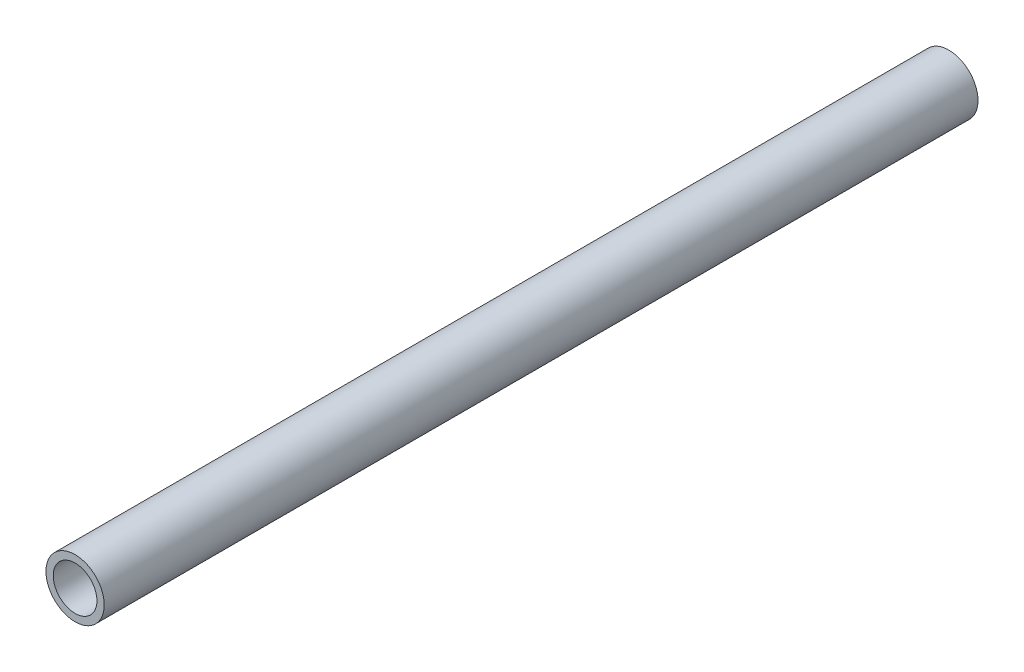
ISO-10303-21;
HEADER;
FILE_DESCRIPTION(('STEP AP214'),'2;1');
FILE_NAME('part.step','',(''),(''),'','','');
FILE_SCHEMA(('AUTOMOTIVE_DESIGN { 1 0 10303 214 1 1 1 1 }'));
ENDSEC;
DATA;
#1=APPLICATION_CONTEXT('core data for automotive mechanical design processes');
#2=APPLICATION_PROTOCOL_DEFINITION('international standard','automotive_design',2000,#1);
#3=PRODUCT_CONTEXT('',#1,'mechanical');
#4=PRODUCT('Part','Part','',(#3));
#5=PRODUCT_RELATED_PRODUCT_CATEGORY('part','',(#4));
#6=PRODUCT_DEFINITION_FORMATION('','',#4);
#7=PRODUCT_DEFINITION_CONTEXT('part definition',#1,'design');
#8=PRODUCT_DEFINITION('design','',#6,#7);
#9=PRODUCT_DEFINITION_SHAPE('','',#8);
#10=(LENGTH_UNIT() NAMED_UNIT(*) SI_UNIT(.MILLI.,.METRE.));
#11=(NAMED_UNIT(*) PLANE_ANGLE_UNIT() SI_UNIT($,.RADIAN.));
#12=(NAMED_UNIT(*) SI_UNIT($,.STERADIAN.) SOLID_ANGLE_UNIT());
#13=UNCERTAINTY_MEASURE_WITH_UNIT(LENGTH_MEASURE(1.E-05),#10,'distance_accuracy_value','');
#14=(GEOMETRIC_REPRESENTATION_CONTEXT(3) GLOBAL_UNCERTAINTY_ASSIGNED_CONTEXT((#13)) GLOBAL_UNIT_ASSIGNED_CONTEXT((#10,
#11,#12)) REPRESENTATION_CONTEXT('',''));
#15=CARTESIAN_POINT('',(0.,0.,0.));
#16=DIRECTION('',(0.,0.,1.));
#17=DIRECTION('',(1.,0.,0.));
#18=AXIS2_PLACEMENT_3D('',#15,#16,#17);
#19=CARTESIAN_POINT('',(0.,0.,240.));
#20=DIRECTION('',(0.,0.,1.));
#21=DIRECTION('',(1.,0.,0.));
#22=AXIS2_PLACEMENT_3D('',#19,#20,#21);
#23=PLANE('',#22);
#24=CARTESIAN_POINT('',(0.,0.,240.));
#25=DIRECTION('',(0.,0.,1.));
#26=DIRECTION('',(1.,0.,0.));
#27=AXIS2_PLACEMENT_3D('',#24,#25,#26);
#28=CIRCLE('',#27,8.);
#29=CARTESIAN_POINT('',(8.,0.,240.));
#30=VERTEX_POINT('',#29);
#31=EDGE_CURVE('E10',#30,#30,#28,.T.);
#32=ORIENTED_EDGE('',*,*,#31,.T.);
#33=EDGE_LOOP('',(#32));
#34=FACE_BOUND('',#33,.T.);
#35=CARTESIAN_POINT('',(0.,0.,240.));
#36=DIRECTION('',(0.,0.,1.));
#37=DIRECTION('',(1.,0.,0.));
#38=AXIS2_PLACEMENT_3D('',#35,#36,#37);
#39=CIRCLE('',#38,6.);
#40=CARTESIAN_POINT('',(6.,0.,240.));
#41=VERTEX_POINT('',#40);
#42=EDGE_CURVE('E56',#41,#41,#39,.T.);
#43=ORIENTED_EDGE('',*,*,#42,.F.);
#44=EDGE_LOOP('',(#43));
#45=FACE_BOUND('',#44,.T.);
#46=ADVANCED_FACE('F43',(#34,#45),#23,.T.);
#47=CARTESIAN_POINT('',(0.,0.,0.));
#48=DIRECTION('',(0.,0.,1.));
#49=DIRECTION('',(1.,0.,0.));
#50=AXIS2_PLACEMENT_3D('',#47,#48,#49);
#51=PLANE('',#50);
#52=CARTESIAN_POINT('',(0.,0.,0.));
#53=DIRECTION('',(0.,0.,1.));
#54=DIRECTION('',(1.,0.,0.));
#55=AXIS2_PLACEMENT_3D('',#52,#53,#54);
#56=CIRCLE('',#55,8.);
#57=CARTESIAN_POINT('',(8.,0.,0.));
#58=VERTEX_POINT('',#57);
#59=EDGE_CURVE('E47',#58,#58,#56,.T.);
#60=ORIENTED_EDGE('',*,*,#59,.F.);
#61=EDGE_LOOP('',(#60));
#62=FACE_BOUND('',#61,.T.);
#63=CARTESIAN_POINT('',(0.,0.,0.));
#64=DIRECTION('',(0.,0.,1.));
#65=DIRECTION('',(1.,0.,0.));
#66=AXIS2_PLACEMENT_3D('',#63,#64,#65);
#67=CIRCLE('',#66,6.);
#68=CARTESIAN_POINT('',(6.,0.,0.));
#69=VERTEX_POINT('',#68);
#70=EDGE_CURVE('E58',#69,#69,#67,.T.);
#71=ORIENTED_EDGE('',*,*,#70,.T.);
#72=EDGE_LOOP('',(#71));
#73=FACE_BOUND('',#72,.T.);
#74=ADVANCED_FACE('F70',(#62,#73),#51,.F.);
#75=CARTESIAN_POINT('',(0.,0.,240.));
#76=DIRECTION('',(0.,0.,-1.));
#77=DIRECTION('',(-1.,0.,0.));
#78=AXIS2_PLACEMENT_3D('',#75,#76,#77);
#79=CYLINDRICAL_SURFACE('',#78,8.);
#80=ORIENTED_EDGE('',*,*,#31,.F.);
#81=EDGE_LOOP('',(#80));
#82=FACE_BOUND('',#81,.T.);
#83=ORIENTED_EDGE('',*,*,#59,.T.);
#84=EDGE_LOOP('',(#83));
#85=FACE_BOUND('',#84,.T.);
#86=ADVANCED_FACE('F45',(#82,#85),#79,.T.);
#87=CARTESIAN_POINT('',(0.,0.,240.));
#88=DIRECTION('',(0.,0.,-1.));
#89=DIRECTION('',(-1.,0.,0.));
#90=AXIS2_PLACEMENT_3D('',#87,#88,#89);
#91=CYLINDRICAL_SURFACE('',#90,6.);
#92=ORIENTED_EDGE('',*,*,#42,.T.);
#93=EDGE_LOOP('',(#92));
#94=FACE_BOUND('',#93,.T.);
#95=ORIENTED_EDGE('',*,*,#70,.F.);
#96=EDGE_LOOP('',(#95));
#97=FACE_BOUND('',#96,.T.);
#98=ADVANCED_FACE('F66',(#94,#97),#91,.F.);
#99=CLOSED_SHELL('',(#46,#74,#86,#98));
#100=MANIFOLD_SOLID_BREP('B2',#99);
#101=ADVANCED_BREP_SHAPE_REPRESENTATION('',(#18,#100),#14);
#102=SHAPE_DEFINITION_REPRESENTATION(#9,#101);
ENDSEC;
END-ISO-10303-21;
